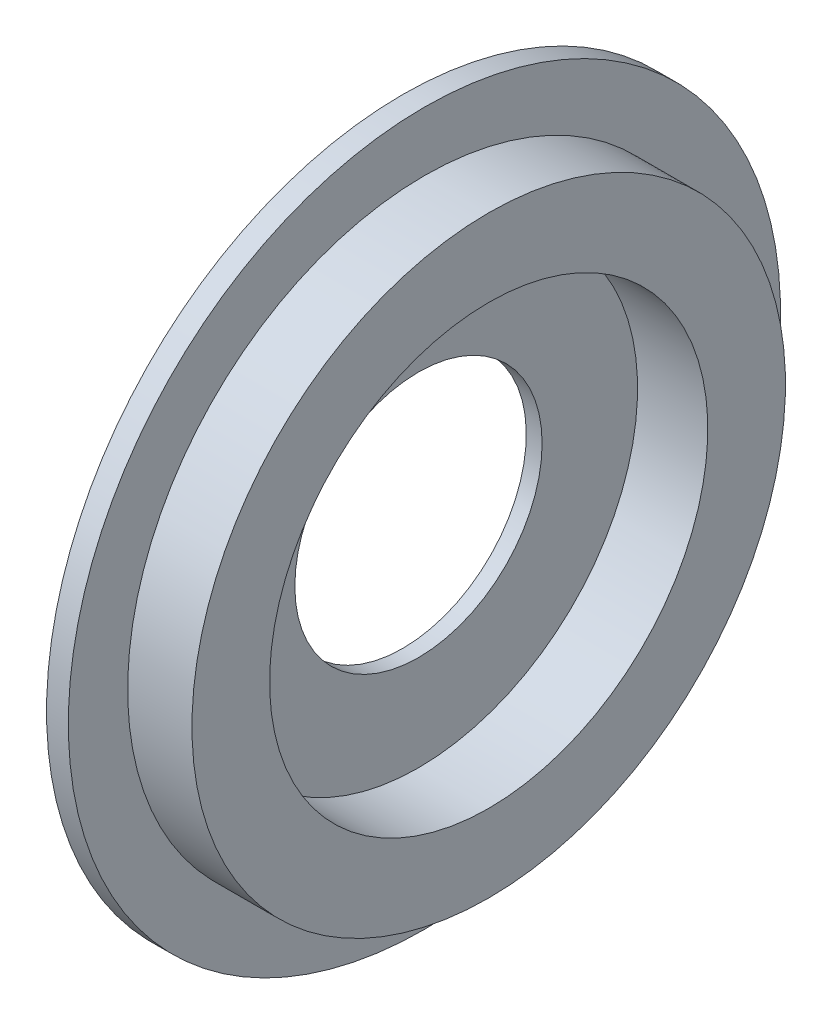
ISO-10303-21;
HEADER;
FILE_DESCRIPTION(('STEP AP214'),'2;1');
FILE_NAME('part.step','',(''),(''),'','','');
FILE_SCHEMA(('AUTOMOTIVE_DESIGN { 1 0 10303 214 1 1 1 1 }'));
ENDSEC;
DATA;
#1=APPLICATION_CONTEXT('core data for automotive mechanical design processes');
#2=APPLICATION_PROTOCOL_DEFINITION('international standard','automotive_design',2000,#1);
#3=PRODUCT_CONTEXT('',#1,'mechanical');
#4=PRODUCT('Part','Part','',(#3));
#5=PRODUCT_RELATED_PRODUCT_CATEGORY('part','',(#4));
#6=PRODUCT_DEFINITION_FORMATION('','',#4);
#7=PRODUCT_DEFINITION_CONTEXT('part definition',#1,'design');
#8=PRODUCT_DEFINITION('design','',#6,#7);
#9=PRODUCT_DEFINITION_SHAPE('','',#8);
#10=(LENGTH_UNIT() NAMED_UNIT(*) SI_UNIT(.MILLI.,.METRE.));
#11=(NAMED_UNIT(*) PLANE_ANGLE_UNIT() SI_UNIT($,.RADIAN.));
#12=(NAMED_UNIT(*) SI_UNIT($,.STERADIAN.) SOLID_ANGLE_UNIT());
#13=UNCERTAINTY_MEASURE_WITH_UNIT(LENGTH_MEASURE(1.E-05),#10,'distance_accuracy_value','');
#14=(GEOMETRIC_REPRESENTATION_CONTEXT(3) GLOBAL_UNCERTAINTY_ASSIGNED_CONTEXT((#13)) GLOBAL_UNIT_ASSIGNED_CONTEXT((#10,
#11,#12)) REPRESENTATION_CONTEXT('',''));
#15=CARTESIAN_POINT('',(0.,0.,0.));
#16=DIRECTION('',(0.,0.,1.));
#17=DIRECTION('',(1.,0.,0.));
#18=AXIS2_PLACEMENT_3D('',#15,#16,#17);
#19=CARTESIAN_POINT('',(0.,0.,0.));
#20=DIRECTION('',(-1.,0.,0.));
#21=DIRECTION('',(0.,-1.,0.));
#22=AXIS2_PLACEMENT_3D('',#19,#20,#21);
#23=PLANE('',#22);
#24=CARTESIAN_POINT('',(0.,0.,0.));
#25=DIRECTION('',(-1.,0.,0.));
#26=DIRECTION('',(0.,-1.,0.));
#27=AXIS2_PLACEMENT_3D('',#24,#25,#26);
#28=CIRCLE('',#27,6.25);
#29=CARTESIAN_POINT('',(0.,-6.25,0.));
#30=VERTEX_POINT('',#29);
#31=EDGE_CURVE('E61',#30,#30,#28,.T.);
#32=ORIENTED_EDGE('',*,*,#31,.F.);
#33=EDGE_LOOP('',(#32));
#34=FACE_BOUND('',#33,.T.);
#35=CARTESIAN_POINT('',(0.,0.,0.));
#36=DIRECTION('',(1.,0.,0.));
#37=DIRECTION('',(0.,1.,0.));
#38=AXIS2_PLACEMENT_3D('',#35,#36,#37);
#39=CIRCLE('',#38,18.);
#40=CARTESIAN_POINT('',(0.,18.,0.));
#41=VERTEX_POINT('',#40);
#42=EDGE_CURVE('E10',#41,#41,#39,.T.);
#43=ORIENTED_EDGE('',*,*,#42,.F.);
#44=EDGE_LOOP('',(#43));
#45=FACE_BOUND('',#44,.T.);
#46=ADVANCED_FACE('F36',(#34,#45),#23,.T.);
#47=CARTESIAN_POINT('',(0.8,0.,0.));
#48=DIRECTION('',(1.,0.,0.));
#49=DIRECTION('',(0.,1.,0.));
#50=AXIS2_PLACEMENT_3D('',#47,#48,#49);
#51=CYLINDRICAL_SURFACE('',#50,18.);
#52=ORIENTED_EDGE('',*,*,#42,.T.);
#53=EDGE_LOOP('',(#52));
#54=FACE_BOUND('',#53,.T.);
#55=CARTESIAN_POINT('',(1.1,0.,0.));
#56=DIRECTION('',(1.,0.,0.));
#57=DIRECTION('',(0.,1.,0.));
#58=AXIS2_PLACEMENT_3D('',#55,#56,#57);
#59=CIRCLE('',#58,18.);
#60=CARTESIAN_POINT('',(1.1,18.,0.));
#61=VERTEX_POINT('',#60);
#62=EDGE_CURVE('E43',#61,#61,#59,.T.);
#63=ORIENTED_EDGE('',*,*,#62,.F.);
#64=EDGE_LOOP('',(#63));
#65=FACE_BOUND('',#64,.T.);
#66=ADVANCED_FACE('F88',(#54,#65),#51,.T.);
#67=CARTESIAN_POINT('',(1.1,18.,0.));
#68=DIRECTION('',(1.,0.,0.));
#69=DIRECTION('',(0.,1.,0.));
#70=AXIS2_PLACEMENT_3D('',#67,#68,#69);
#71=PLANE('',#70);
#72=ORIENTED_EDGE('',*,*,#62,.T.);
#73=EDGE_LOOP('',(#72));
#74=FACE_BOUND('',#73,.T.);
#75=CARTESIAN_POINT('',(1.1,0.,0.));
#76=DIRECTION('',(1.,0.,0.));
#77=DIRECTION('',(0.,1.,0.));
#78=AXIS2_PLACEMENT_3D('',#75,#76,#77);
#79=CIRCLE('',#78,15.);
#80=CARTESIAN_POINT('',(1.1,15.,0.));
#81=VERTEX_POINT('',#80);
#82=EDGE_CURVE('E47',#81,#81,#79,.T.);
#83=ORIENTED_EDGE('',*,*,#82,.F.);
#84=EDGE_LOOP('',(#83));
#85=FACE_BOUND('',#84,.T.);
#86=ADVANCED_FACE('F93',(#74,#85),#71,.T.);
#87=CARTESIAN_POINT('',(0.8,0.,0.));
#88=DIRECTION('',(1.,0.,0.));
#89=DIRECTION('',(0.,1.,0.));
#90=AXIS2_PLACEMENT_3D('',#87,#88,#89);
#91=CYLINDRICAL_SURFACE('',#90,15.);
#92=ORIENTED_EDGE('',*,*,#82,.T.);
#93=EDGE_LOOP('',(#92));
#94=FACE_BOUND('',#93,.T.);
#95=CARTESIAN_POINT('',(4.35,0.,0.));
#96=DIRECTION('',(1.,0.,0.));
#97=DIRECTION('',(0.,1.,0.));
#98=AXIS2_PLACEMENT_3D('',#95,#96,#97);
#99=CIRCLE('',#98,15.);
#100=CARTESIAN_POINT('',(4.35,15.,0.));
#101=VERTEX_POINT('',#100);
#102=EDGE_CURVE('E52',#101,#101,#99,.T.);
#103=ORIENTED_EDGE('',*,*,#102,.F.);
#104=EDGE_LOOP('',(#103));
#105=FACE_BOUND('',#104,.T.);
#106=ADVANCED_FACE('F84',(#94,#105),#91,.T.);
#107=CARTESIAN_POINT('',(4.35,15.,0.));
#108=DIRECTION('',(1.,0.,0.));
#109=DIRECTION('',(0.,1.,0.));
#110=AXIS2_PLACEMENT_3D('',#107,#108,#109);
#111=PLANE('',#110);
#112=ORIENTED_EDGE('',*,*,#102,.T.);
#113=EDGE_LOOP('',(#112));
#114=FACE_BOUND('',#113,.T.);
#115=CARTESIAN_POINT('',(4.35,0.,0.));
#116=DIRECTION('',(1.,0.,0.));
#117=DIRECTION('',(0.,1.,0.));
#118=AXIS2_PLACEMENT_3D('',#115,#116,#117);
#119=CIRCLE('',#118,11.075);
#120=CARTESIAN_POINT('',(4.35,11.075,0.));
#121=VERTEX_POINT('',#120);
#122=EDGE_CURVE('E55',#121,#121,#119,.T.);
#123=ORIENTED_EDGE('',*,*,#122,.F.);
#124=EDGE_LOOP('',(#123));
#125=FACE_BOUND('',#124,.T.);
#126=ADVANCED_FACE('F78',(#114,#125),#111,.T.);
#127=CARTESIAN_POINT('',(0.8,0.,0.));
#128=DIRECTION('',(1.,0.,0.));
#129=DIRECTION('',(0.,1.,0.));
#130=AXIS2_PLACEMENT_3D('',#127,#128,#129);
#131=CYLINDRICAL_SURFACE('',#130,11.075);
#132=ORIENTED_EDGE('',*,*,#122,.T.);
#133=EDGE_LOOP('',(#132));
#134=FACE_BOUND('',#133,.T.);
#135=CARTESIAN_POINT('',(0.799999999999998,0.,0.));
#136=DIRECTION('',(1.,0.,0.));
#137=DIRECTION('',(0.,1.,0.));
#138=AXIS2_PLACEMENT_3D('',#135,#136,#137);
#139=CIRCLE('',#138,11.075);
#140=CARTESIAN_POINT('',(0.799999999999999,11.075,0.));
#141=VERTEX_POINT('',#140);
#142=EDGE_CURVE('E58',#141,#141,#139,.T.);
#143=ORIENTED_EDGE('',*,*,#142,.F.);
#144=EDGE_LOOP('',(#143));
#145=FACE_BOUND('',#144,.T.);
#146=ADVANCED_FACE('F73',(#134,#145),#131,.F.);
#147=CARTESIAN_POINT('',(0.8,11.075,0.));
#148=DIRECTION('',(1.,0.,0.));
#149=DIRECTION('',(0.,1.,0.));
#150=AXIS2_PLACEMENT_3D('',#147,#148,#149);
#151=PLANE('',#150);
#152=CARTESIAN_POINT('',(0.799999999999999,0.,0.));
#153=DIRECTION('',(1.,0.,0.));
#154=DIRECTION('',(0.,1.,0.));
#155=AXIS2_PLACEMENT_3D('',#152,#153,#154);
#156=CIRCLE('',#155,6.25);
#157=CARTESIAN_POINT('',(0.799999999999999,6.25,0.));
#158=VERTEX_POINT('',#157);
#159=EDGE_CURVE('E39',#158,#158,#156,.T.);
#160=ORIENTED_EDGE('',*,*,#159,.F.);
#161=EDGE_LOOP('',(#160));
#162=FACE_BOUND('',#161,.T.);
#163=ORIENTED_EDGE('',*,*,#142,.T.);
#164=EDGE_LOOP('',(#163));
#165=FACE_BOUND('',#164,.T.);
#166=ADVANCED_FACE('F70',(#162,#165),#151,.T.);
#167=CARTESIAN_POINT('',(4.35,0.,0.));
#168=DIRECTION('',(-1.,0.,0.));
#169=DIRECTION('',(0.,-1.,0.));
#170=AXIS2_PLACEMENT_3D('',#167,#168,#169);
#171=CYLINDRICAL_SURFACE('',#170,6.25);
#172=ORIENTED_EDGE('',*,*,#159,.T.);
#173=EDGE_LOOP('',(#172));
#174=FACE_BOUND('',#173,.T.);
#175=ORIENTED_EDGE('',*,*,#31,.T.);
#176=EDGE_LOOP('',(#175));
#177=FACE_BOUND('',#176,.T.);
#178=ADVANCED_FACE('F68',(#174,#177),#171,.F.);
#179=CLOSED_SHELL('',(#46,#66,#86,#106,#126,#146,#166,#178));
#180=MANIFOLD_SOLID_BREP('B2',#179);
#181=ADVANCED_BREP_SHAPE_REPRESENTATION('',(#18,#180),#14);
#182=SHAPE_DEFINITION_REPRESENTATION(#9,#181);
ENDSEC;
END-ISO-10303-21;
